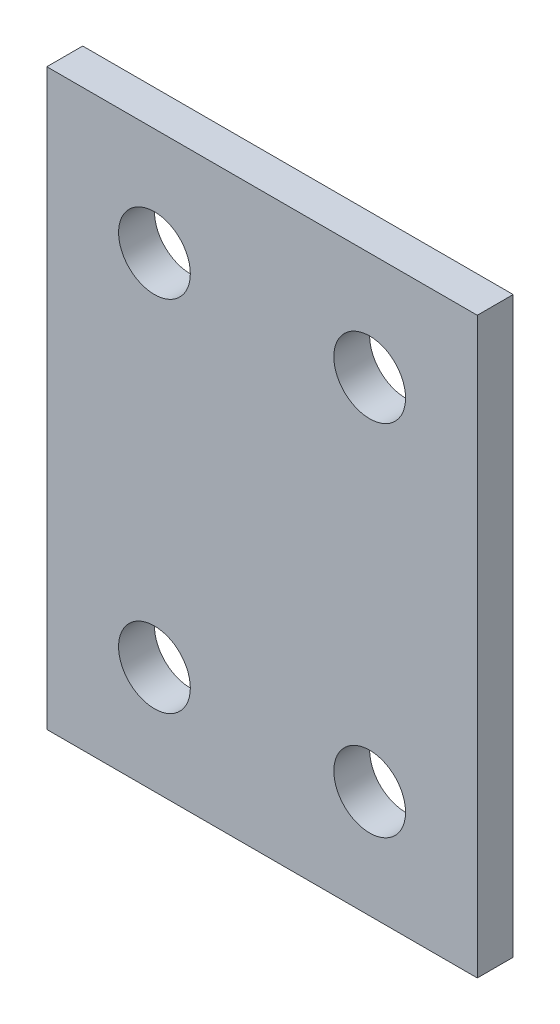
ISO-10303-21;
HEADER;
FILE_DESCRIPTION(('STEP AP214'),'2;1');
FILE_NAME('part.step','',(''),(''),'','','');
FILE_SCHEMA(('AUTOMOTIVE_DESIGN { 1 0 10303 214 1 1 1 1 }'));
ENDSEC;
DATA;
#1=APPLICATION_CONTEXT('core data for automotive mechanical design processes');
#2=APPLICATION_PROTOCOL_DEFINITION('international standard','automotive_design',2000,#1);
#3=PRODUCT_CONTEXT('',#1,'mechanical');
#4=PRODUCT('Part','Part','',(#3));
#5=PRODUCT_RELATED_PRODUCT_CATEGORY('part','',(#4));
#6=PRODUCT_DEFINITION_FORMATION('','',#4);
#7=PRODUCT_DEFINITION_CONTEXT('part definition',#1,'design');
#8=PRODUCT_DEFINITION('design','',#6,#7);
#9=PRODUCT_DEFINITION_SHAPE('','',#8);
#10=(LENGTH_UNIT() NAMED_UNIT(*) SI_UNIT(.MILLI.,.METRE.));
#11=(NAMED_UNIT(*) PLANE_ANGLE_UNIT() SI_UNIT($,.RADIAN.));
#12=(NAMED_UNIT(*) SI_UNIT($,.STERADIAN.) SOLID_ANGLE_UNIT());
#13=UNCERTAINTY_MEASURE_WITH_UNIT(LENGTH_MEASURE(1.E-05),#10,'distance_accuracy_value','');
#14=(GEOMETRIC_REPRESENTATION_CONTEXT(3) GLOBAL_UNCERTAINTY_ASSIGNED_CONTEXT((#13)) GLOBAL_UNIT_ASSIGNED_CONTEXT((#10,
#11,#12)) REPRESENTATION_CONTEXT('',''));
#15=CARTESIAN_POINT('',(0.,0.,0.));
#16=DIRECTION('',(0.,0.,1.));
#17=DIRECTION('',(1.,0.,0.));
#18=AXIS2_PLACEMENT_3D('',#15,#16,#17);
#19=CARTESIAN_POINT('',(0.,0.,-5.));
#20=DIRECTION('',(-1.,0.,0.));
#21=DIRECTION('',(0.,0.,1.));
#22=AXIS2_PLACEMENT_3D('',#19,#20,#21);
#23=PLANE('',#22);
#24=DIRECTION('',(0.,-1.,0.));
#25=VECTOR('',#24,1.);
#26=CARTESIAN_POINT('',(0.,0.,0.));
#27=LINE('',#26,#25);
#28=CARTESIAN_POINT('',(0.,80.,0.));
#29=VERTEX_POINT('',#28);
#30=CARTESIAN_POINT('',(0.,0.,0.));
#31=VERTEX_POINT('',#30);
#32=EDGE_CURVE('E103',#29,#31,#27,.T.);
#33=ORIENTED_EDGE('',*,*,#32,.F.);
#34=DIRECTION('',(0.,0.,1.));
#35=VECTOR('',#34,1.);
#36=CARTESIAN_POINT('',(0.,80.,-5.));
#37=LINE('',#36,#35);
#38=CARTESIAN_POINT('',(0.,80.,-5.));
#39=VERTEX_POINT('',#38);
#40=EDGE_CURVE('E11',#39,#29,#37,.T.);
#41=ORIENTED_EDGE('',*,*,#40,.F.);
#42=DIRECTION('',(0.,-1.,0.));
#43=VECTOR('',#42,1.);
#44=CARTESIAN_POINT('',(0.,0.,-5.));
#45=LINE('',#44,#43);
#46=CARTESIAN_POINT('',(0.,0.,-5.));
#47=VERTEX_POINT('',#46);
#48=EDGE_CURVE('E96',#39,#47,#45,.T.);
#49=ORIENTED_EDGE('',*,*,#48,.T.);
#50=DIRECTION('',(0.,0.,1.));
#51=VECTOR('',#50,1.);
#52=CARTESIAN_POINT('',(0.,0.,-5.));
#53=LINE('',#52,#51);
#54=EDGE_CURVE('E41',#47,#31,#53,.T.);
#55=ORIENTED_EDGE('',*,*,#54,.T.);
#56=EDGE_LOOP('',(#33,#41,#49,#55));
#57=FACE_BOUND('',#56,.T.);
#58=ADVANCED_FACE('F38',(#57),#23,.T.);
#59=CARTESIAN_POINT('',(0.,80.,-5.));
#60=DIRECTION('',(0.,1.,0.));
#61=DIRECTION('',(0.,0.,1.));
#62=AXIS2_PLACEMENT_3D('',#59,#60,#61);
#63=PLANE('',#62);
#64=DIRECTION('',(-1.,0.,0.));
#65=VECTOR('',#64,1.);
#66=CARTESIAN_POINT('',(0.,80.,0.));
#67=LINE('',#66,#65);
#68=CARTESIAN_POINT('',(60.,80.,0.));
#69=VERTEX_POINT('',#68);
#70=EDGE_CURVE('E98',#69,#29,#67,.T.);
#71=ORIENTED_EDGE('',*,*,#70,.F.);
#72=DIRECTION('',(0.,0.,1.));
#73=VECTOR('',#72,1.);
#74=CARTESIAN_POINT('',(60.,80.,-5.));
#75=LINE('',#74,#73);
#76=CARTESIAN_POINT('',(60.,80.,-5.));
#77=VERTEX_POINT('',#76);
#78=EDGE_CURVE('E47',#77,#69,#75,.T.);
#79=ORIENTED_EDGE('',*,*,#78,.F.);
#80=DIRECTION('',(-1.,0.,0.));
#81=VECTOR('',#80,1.);
#82=CARTESIAN_POINT('',(0.,80.,-5.));
#83=LINE('',#82,#81);
#84=EDGE_CURVE('E93',#77,#39,#83,.T.);
#85=ORIENTED_EDGE('',*,*,#84,.T.);
#86=ORIENTED_EDGE('',*,*,#40,.T.);
#87=EDGE_LOOP('',(#71,#79,#85,#86));
#88=FACE_BOUND('',#87,.T.);
#89=ADVANCED_FACE('F114',(#88),#63,.T.);
#90=CARTESIAN_POINT('',(60.,0.,-5.));
#91=DIRECTION('',(1.,0.,0.));
#92=DIRECTION('',(0.,0.,-1.));
#93=AXIS2_PLACEMENT_3D('',#90,#91,#92);
#94=PLANE('',#93);
#95=DIRECTION('',(0.,1.,0.));
#96=VECTOR('',#95,1.);
#97=CARTESIAN_POINT('',(60.,0.,0.));
#98=LINE('',#97,#96);
#99=CARTESIAN_POINT('',(60.,0.,0.));
#100=VERTEX_POINT('',#99);
#101=EDGE_CURVE('E88',#100,#69,#98,.T.);
#102=ORIENTED_EDGE('',*,*,#101,.F.);
#103=DIRECTION('',(0.,0.,1.));
#104=VECTOR('',#103,1.);
#105=CARTESIAN_POINT('',(60.,0.,-5.));
#106=LINE('',#105,#104);
#107=CARTESIAN_POINT('',(60.,0.,-5.));
#108=VERTEX_POINT('',#107);
#109=EDGE_CURVE('E83',#108,#100,#106,.T.);
#110=ORIENTED_EDGE('',*,*,#109,.F.);
#111=DIRECTION('',(0.,1.,0.));
#112=VECTOR('',#111,1.);
#113=CARTESIAN_POINT('',(60.,0.,-5.));
#114=LINE('',#113,#112);
#115=EDGE_CURVE('E86',#108,#77,#114,.T.);
#116=ORIENTED_EDGE('',*,*,#115,.T.);
#117=ORIENTED_EDGE('',*,*,#78,.T.);
#118=EDGE_LOOP('',(#102,#110,#116,#117));
#119=FACE_BOUND('',#118,.T.);
#120=ADVANCED_FACE('F85',(#119),#94,.T.);
#121=CARTESIAN_POINT('',(0.,0.,-5.));
#122=DIRECTION('',(0.,-1.,0.));
#123=DIRECTION('',(0.,0.,-1.));
#124=AXIS2_PLACEMENT_3D('',#121,#122,#123);
#125=PLANE('',#124);
#126=DIRECTION('',(1.,0.,0.));
#127=VECTOR('',#126,1.);
#128=CARTESIAN_POINT('',(0.,0.,0.));
#129=LINE('',#128,#127);
#130=EDGE_CURVE('E106',#31,#100,#129,.T.);
#131=ORIENTED_EDGE('',*,*,#130,.F.);
#132=ORIENTED_EDGE('',*,*,#54,.F.);
#133=DIRECTION('',(1.,0.,0.));
#134=VECTOR('',#133,1.);
#135=CARTESIAN_POINT('',(0.,0.,-5.));
#136=LINE('',#135,#134);
#137=EDGE_CURVE('E92',#47,#108,#136,.T.);
#138=ORIENTED_EDGE('',*,*,#137,.T.);
#139=ORIENTED_EDGE('',*,*,#109,.T.);
#140=EDGE_LOOP('',(#131,#132,#138,#139));
#141=FACE_BOUND('',#140,.T.);
#142=ADVANCED_FACE('F95',(#141),#125,.T.);
#143=CARTESIAN_POINT('',(0.,80.,-5.));
#144=DIRECTION('',(0.,0.,-1.));
#145=DIRECTION('',(-1.,0.,0.));
#146=AXIS2_PLACEMENT_3D('',#143,#144,#145);
#147=PLANE('',#146);
#148=CARTESIAN_POINT('',(44.9999999999998,65.,-5.));
#149=DIRECTION('',(0.,0.,1.));
#150=DIRECTION('',(1.,0.,0.));
#151=AXIS2_PLACEMENT_3D('',#148,#149,#150);
#152=CIRCLE('',#151,5.);
#153=CARTESIAN_POINT('',(49.9999999999998,65.,-5.));
#154=VERTEX_POINT('',#153);
#155=EDGE_CURVE('E155',#154,#154,#152,.T.);
#156=ORIENTED_EDGE('',*,*,#155,.T.);
#157=EDGE_LOOP('',(#156));
#158=FACE_BOUND('',#157,.T.);
#159=CARTESIAN_POINT('',(14.9999999999998,65.,-5.));
#160=DIRECTION('',(0.,0.,1.));
#161=DIRECTION('',(1.,0.,0.));
#162=AXIS2_PLACEMENT_3D('',#159,#160,#161);
#163=CIRCLE('',#162,5.);
#164=CARTESIAN_POINT('',(19.9999999999998,65.,-5.));
#165=VERTEX_POINT('',#164);
#166=EDGE_CURVE('E163',#165,#165,#163,.T.);
#167=ORIENTED_EDGE('',*,*,#166,.T.);
#168=EDGE_LOOP('',(#167));
#169=FACE_BOUND('',#168,.T.);
#170=CARTESIAN_POINT('',(45.,15.,-5.));
#171=DIRECTION('',(0.,0.,1.));
#172=DIRECTION('',(1.,0.,0.));
#173=AXIS2_PLACEMENT_3D('',#170,#171,#172);
#174=CIRCLE('',#173,5.);
#175=CARTESIAN_POINT('',(50.,15.,-5.));
#176=VERTEX_POINT('',#175);
#177=EDGE_CURVE('E169',#176,#176,#174,.T.);
#178=ORIENTED_EDGE('',*,*,#177,.T.);
#179=EDGE_LOOP('',(#178));
#180=FACE_BOUND('',#179,.T.);
#181=CARTESIAN_POINT('',(15.,15.,-5.));
#182=DIRECTION('',(0.,0.,1.));
#183=DIRECTION('',(1.,0.,0.));
#184=AXIS2_PLACEMENT_3D('',#181,#182,#183);
#185=CIRCLE('',#184,5.);
#186=CARTESIAN_POINT('',(20.,15.,-5.));
#187=VERTEX_POINT('',#186);
#188=EDGE_CURVE('E107',#187,#187,#185,.T.);
#189=ORIENTED_EDGE('',*,*,#188,.T.);
#190=EDGE_LOOP('',(#189));
#191=FACE_BOUND('',#190,.T.);
#192=ORIENTED_EDGE('',*,*,#48,.F.);
#193=ORIENTED_EDGE('',*,*,#84,.F.);
#194=ORIENTED_EDGE('',*,*,#115,.F.);
#195=ORIENTED_EDGE('',*,*,#137,.F.);
#196=EDGE_LOOP('',(#192,#193,#194,#195));
#197=FACE_BOUND('',#196,.T.);
#198=ADVANCED_FACE('F91',(#158,#169,#180,#191,#197),#147,.T.);
#199=CARTESIAN_POINT('',(0.,80.,0.));
#200=DIRECTION('',(0.,0.,-1.));
#201=DIRECTION('',(-1.,0.,0.));
#202=AXIS2_PLACEMENT_3D('',#199,#200,#201);
#203=PLANE('',#202);
#204=CARTESIAN_POINT('',(44.9999999999998,65.,0.));
#205=DIRECTION('',(0.,0.,1.));
#206=DIRECTION('',(1.,0.,0.));
#207=AXIS2_PLACEMENT_3D('',#204,#205,#206);
#208=CIRCLE('',#207,5.);
#209=CARTESIAN_POINT('',(49.9999999999998,65.,0.));
#210=VERTEX_POINT('',#209);
#211=EDGE_CURVE('E158',#210,#210,#208,.T.);
#212=ORIENTED_EDGE('',*,*,#211,.F.);
#213=EDGE_LOOP('',(#212));
#214=FACE_BOUND('',#213,.T.);
#215=CARTESIAN_POINT('',(14.9999999999998,65.,0.));
#216=DIRECTION('',(0.,0.,1.));
#217=DIRECTION('',(1.,0.,0.));
#218=AXIS2_PLACEMENT_3D('',#215,#216,#217);
#219=CIRCLE('',#218,5.);
#220=CARTESIAN_POINT('',(19.9999999999998,65.,0.));
#221=VERTEX_POINT('',#220);
#222=EDGE_CURVE('E160',#221,#221,#219,.T.);
#223=ORIENTED_EDGE('',*,*,#222,.F.);
#224=EDGE_LOOP('',(#223));
#225=FACE_BOUND('',#224,.T.);
#226=CARTESIAN_POINT('',(45.,15.,0.));
#227=DIRECTION('',(0.,0.,1.));
#228=DIRECTION('',(1.,0.,0.));
#229=AXIS2_PLACEMENT_3D('',#226,#227,#228);
#230=CIRCLE('',#229,5.);
#231=CARTESIAN_POINT('',(50.,15.,0.));
#232=VERTEX_POINT('',#231);
#233=EDGE_CURVE('E166',#232,#232,#230,.T.);
#234=ORIENTED_EDGE('',*,*,#233,.F.);
#235=EDGE_LOOP('',(#234));
#236=FACE_BOUND('',#235,.T.);
#237=CARTESIAN_POINT('',(15.,15.,0.));
#238=DIRECTION('',(0.,0.,1.));
#239=DIRECTION('',(1.,0.,0.));
#240=AXIS2_PLACEMENT_3D('',#237,#238,#239);
#241=CIRCLE('',#240,5.);
#242=CARTESIAN_POINT('',(20.,15.,0.));
#243=VERTEX_POINT('',#242);
#244=EDGE_CURVE('E172',#243,#243,#241,.T.);
#245=ORIENTED_EDGE('',*,*,#244,.F.);
#246=EDGE_LOOP('',(#245));
#247=FACE_BOUND('',#246,.T.);
#248=ORIENTED_EDGE('',*,*,#32,.T.);
#249=ORIENTED_EDGE('',*,*,#130,.T.);
#250=ORIENTED_EDGE('',*,*,#101,.T.);
#251=ORIENTED_EDGE('',*,*,#70,.T.);
#252=EDGE_LOOP('',(#248,#249,#250,#251));
#253=FACE_BOUND('',#252,.T.);
#254=ADVANCED_FACE('F113',(#214,#225,#236,#247,#253),#203,.F.);
#255=CARTESIAN_POINT('',(15.,15.,-5.));
#256=DIRECTION('',(0.,0.,1.));
#257=DIRECTION('',(1.,0.,0.));
#258=AXIS2_PLACEMENT_3D('',#255,#256,#257);
#259=CYLINDRICAL_SURFACE('',#258,5.);
#260=ORIENTED_EDGE('',*,*,#188,.F.);
#261=EDGE_LOOP('',(#260));
#262=FACE_BOUND('',#261,.T.);
#263=ORIENTED_EDGE('',*,*,#244,.T.);
#264=EDGE_LOOP('',(#263));
#265=FACE_BOUND('',#264,.T.);
#266=ADVANCED_FACE('F132',(#262,#265),#259,.F.);
#267=CARTESIAN_POINT('',(45.,15.,-5.));
#268=DIRECTION('',(0.,0.,1.));
#269=DIRECTION('',(1.,0.,0.));
#270=AXIS2_PLACEMENT_3D('',#267,#268,#269);
#271=CYLINDRICAL_SURFACE('',#270,5.);
#272=ORIENTED_EDGE('',*,*,#177,.F.);
#273=EDGE_LOOP('',(#272));
#274=FACE_BOUND('',#273,.T.);
#275=ORIENTED_EDGE('',*,*,#233,.T.);
#276=EDGE_LOOP('',(#275));
#277=FACE_BOUND('',#276,.T.);
#278=ADVANCED_FACE('F139',(#274,#277),#271,.F.);
#279=CARTESIAN_POINT('',(14.9999999999998,65.,-5.));
#280=DIRECTION('',(0.,0.,1.));
#281=DIRECTION('',(1.,0.,0.));
#282=AXIS2_PLACEMENT_3D('',#279,#280,#281);
#283=CYLINDRICAL_SURFACE('',#282,5.);
#284=ORIENTED_EDGE('',*,*,#166,.F.);
#285=EDGE_LOOP('',(#284));
#286=FACE_BOUND('',#285,.T.);
#287=ORIENTED_EDGE('',*,*,#222,.T.);
#288=EDGE_LOOP('',(#287));
#289=FACE_BOUND('',#288,.T.);
#290=ADVANCED_FACE('F143',(#286,#289),#283,.F.);
#291=CARTESIAN_POINT('',(44.9999999999998,65.,-5.));
#292=DIRECTION('',(0.,0.,1.));
#293=DIRECTION('',(1.,0.,0.));
#294=AXIS2_PLACEMENT_3D('',#291,#292,#293);
#295=CYLINDRICAL_SURFACE('',#294,5.);
#296=ORIENTED_EDGE('',*,*,#155,.F.);
#297=EDGE_LOOP('',(#296));
#298=FACE_BOUND('',#297,.T.);
#299=ORIENTED_EDGE('',*,*,#211,.T.);
#300=EDGE_LOOP('',(#299));
#301=FACE_BOUND('',#300,.T.);
#302=ADVANCED_FACE('F147',(#298,#301),#295,.F.);
#303=CLOSED_SHELL('',(#58,#89,#120,#142,#198,#254,#266,#278,#290,#302));
#304=MANIFOLD_SOLID_BREP('B2',#303);
#305=ADVANCED_BREP_SHAPE_REPRESENTATION('',(#18,#304),#14);
#306=SHAPE_DEFINITION_REPRESENTATION(#9,#305);
ENDSEC;
END-ISO-10303-21;
